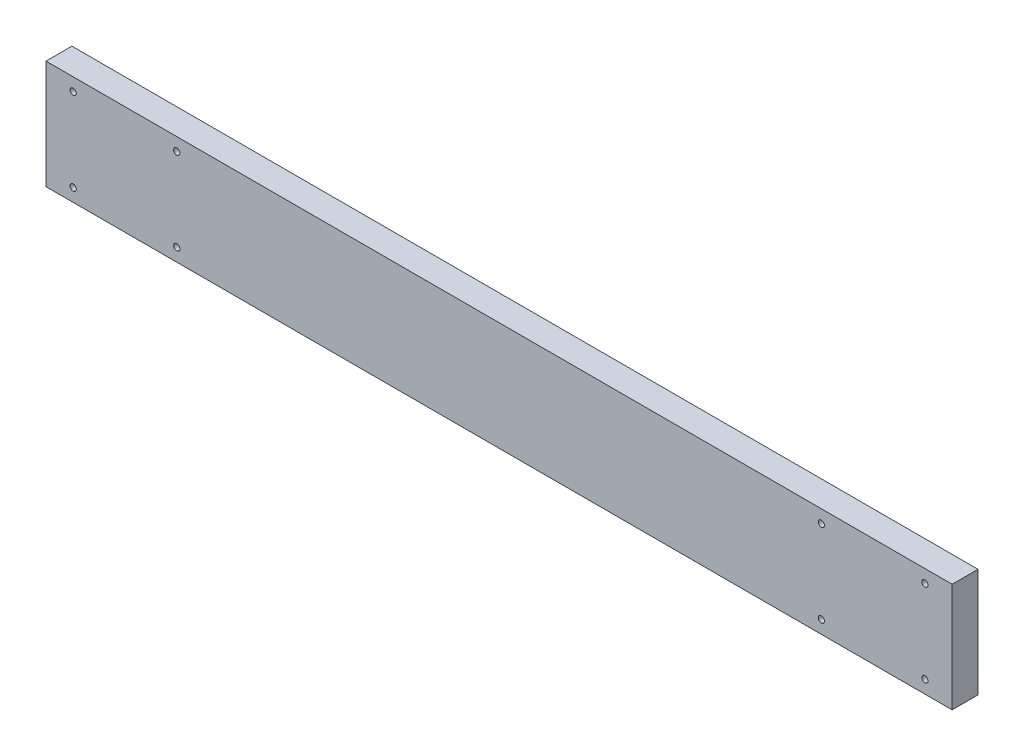
ISO-10303-21;
HEADER;
FILE_DESCRIPTION(('STEP AP214'),'2;1');
FILE_NAME('part.step','',(''),(''),'','','');
FILE_SCHEMA(('AUTOMOTIVE_DESIGN { 1 0 10303 214 1 1 1 1 }'));
ENDSEC;
DATA;
#1=APPLICATION_CONTEXT('core data for automotive mechanical design processes');
#2=APPLICATION_PROTOCOL_DEFINITION('international standard','automotive_design',2000,#1);
#3=PRODUCT_CONTEXT('',#1,'mechanical');
#4=PRODUCT('Part','Part','',(#3));
#5=PRODUCT_RELATED_PRODUCT_CATEGORY('part','',(#4));
#6=PRODUCT_DEFINITION_FORMATION('','',#4);
#7=PRODUCT_DEFINITION_CONTEXT('part definition',#1,'design');
#8=PRODUCT_DEFINITION('design','',#6,#7);
#9=PRODUCT_DEFINITION_SHAPE('','',#8);
#10=(LENGTH_UNIT() NAMED_UNIT(*) SI_UNIT(.MILLI.,.METRE.));
#11=(NAMED_UNIT(*) PLANE_ANGLE_UNIT() SI_UNIT($,.RADIAN.));
#12=(NAMED_UNIT(*) SI_UNIT($,.STERADIAN.) SOLID_ANGLE_UNIT());
#13=UNCERTAINTY_MEASURE_WITH_UNIT(LENGTH_MEASURE(1.E-05),#10,'distance_accuracy_value','');
#14=(GEOMETRIC_REPRESENTATION_CONTEXT(3) GLOBAL_UNCERTAINTY_ASSIGNED_CONTEXT((#13)) GLOBAL_UNIT_ASSIGNED_CONTEXT((#10,
#11,#12)) REPRESENTATION_CONTEXT('',''));
#15=CARTESIAN_POINT('',(0.,0.,0.));
#16=DIRECTION('',(0.,0.,1.));
#17=DIRECTION('',(1.,0.,0.));
#18=AXIS2_PLACEMENT_3D('',#15,#16,#17);
#19=CARTESIAN_POINT('',(0.,0.,10.));
#20=DIRECTION('',(0.,0.,-1.));
#21=DIRECTION('',(-1.,0.,0.));
#22=AXIS2_PLACEMENT_3D('',#19,#20,#21);
#23=PLANE('',#22);
#24=CARTESIAN_POINT('',(-164.5,16.01,10.));
#25=DIRECTION('',(0.,0.,1.));
#26=DIRECTION('',(1.,0.,0.));
#27=AXIS2_PLACEMENT_3D('',#24,#25,#26);
#28=CIRCLE('',#27,1.20000000000001);
#29=CARTESIAN_POINT('',(-163.3,16.01,10.));
#30=VERTEX_POINT('',#29);
#31=EDGE_CURVE('E195',#30,#30,#28,.T.);
#32=ORIENTED_EDGE('',*,*,#31,.F.);
#33=EDGE_LOOP('',(#32));
#34=FACE_BOUND('',#33,.T.);
#35=CARTESIAN_POINT('',(-124.5,16.01,10.));
#36=DIRECTION('',(0.,0.,1.));
#37=DIRECTION('',(1.,0.,0.));
#38=AXIS2_PLACEMENT_3D('',#35,#36,#37);
#39=CIRCLE('',#38,1.19999999999999);
#40=CARTESIAN_POINT('',(-123.3,16.01,10.));
#41=VERTEX_POINT('',#40);
#42=EDGE_CURVE('E187',#41,#41,#39,.T.);
#43=ORIENTED_EDGE('',*,*,#42,.F.);
#44=EDGE_LOOP('',(#43));
#45=FACE_BOUND('',#44,.T.);
#46=CARTESIAN_POINT('',(-164.5,-16.01,10.));
#47=DIRECTION('',(0.,0.,1.));
#48=DIRECTION('',(1.,0.,0.));
#49=AXIS2_PLACEMENT_3D('',#46,#47,#48);
#50=CIRCLE('',#49,1.20000000000001);
#51=CARTESIAN_POINT('',(-163.3,-16.01,10.));
#52=VERTEX_POINT('',#51);
#53=EDGE_CURVE('E171',#52,#52,#50,.T.);
#54=ORIENTED_EDGE('',*,*,#53,.F.);
#55=EDGE_LOOP('',(#54));
#56=FACE_BOUND('',#55,.T.);
#57=CARTESIAN_POINT('',(164.5,-16.01,10.));
#58=DIRECTION('',(0.,0.,1.));
#59=DIRECTION('',(1.,0.,0.));
#60=AXIS2_PLACEMENT_3D('',#57,#58,#59);
#61=CIRCLE('',#60,1.20000000000001);
#62=CARTESIAN_POINT('',(165.7,-16.01,10.));
#63=VERTEX_POINT('',#62);
#64=EDGE_CURVE('E163',#63,#63,#61,.T.);
#65=ORIENTED_EDGE('',*,*,#64,.F.);
#66=EDGE_LOOP('',(#65));
#67=FACE_BOUND('',#66,.T.);
#68=CARTESIAN_POINT('',(124.5,-16.01,10.));
#69=DIRECTION('',(0.,0.,1.));
#70=DIRECTION('',(1.,0.,0.));
#71=AXIS2_PLACEMENT_3D('',#68,#69,#70);
#72=CIRCLE('',#71,1.19999999999999);
#73=CARTESIAN_POINT('',(125.7,-16.01,10.));
#74=VERTEX_POINT('',#73);
#75=EDGE_CURVE('E155',#74,#74,#72,.T.);
#76=ORIENTED_EDGE('',*,*,#75,.F.);
#77=EDGE_LOOP('',(#76));
#78=FACE_BOUND('',#77,.T.);
#79=CARTESIAN_POINT('',(124.5,16.01,10.));
#80=DIRECTION('',(0.,0.,1.));
#81=DIRECTION('',(1.,0.,0.));
#82=AXIS2_PLACEMENT_3D('',#79,#80,#81);
#83=CIRCLE('',#82,1.19999999999999);
#84=CARTESIAN_POINT('',(125.7,16.01,10.));
#85=VERTEX_POINT('',#84);
#86=EDGE_CURVE('E147',#85,#85,#83,.T.);
#87=ORIENTED_EDGE('',*,*,#86,.F.);
#88=EDGE_LOOP('',(#87));
#89=FACE_BOUND('',#88,.T.);
#90=CARTESIAN_POINT('',(164.5,16.01,10.));
#91=DIRECTION('',(0.,0.,1.));
#92=DIRECTION('',(1.,0.,0.));
#93=AXIS2_PLACEMENT_3D('',#90,#91,#92);
#94=CIRCLE('',#93,1.20000000000001);
#95=CARTESIAN_POINT('',(165.7,16.01,10.));
#96=VERTEX_POINT('',#95);
#97=EDGE_CURVE('E139',#96,#96,#94,.T.);
#98=ORIENTED_EDGE('',*,*,#97,.F.);
#99=EDGE_LOOP('',(#98));
#100=FACE_BOUND('',#99,.T.);
#101=DIRECTION('',(0.,1.,0.));
#102=VECTOR('',#101,1.);
#103=CARTESIAN_POINT('',(175.,-21.01,10.));
#104=LINE('',#103,#102);
#105=CARTESIAN_POINT('',(175.,-21.01,10.));
#106=VERTEX_POINT('',#105);
#107=CARTESIAN_POINT('',(175.,21.01,10.));
#108=VERTEX_POINT('',#107);
#109=EDGE_CURVE('E98',#106,#108,#104,.T.);
#110=ORIENTED_EDGE('',*,*,#109,.T.);
#111=DIRECTION('',(-1.,0.,0.));
#112=VECTOR('',#111,1.);
#113=CARTESIAN_POINT('',(-175.,21.01,10.));
#114=LINE('',#113,#112);
#115=CARTESIAN_POINT('',(-175.,21.01,10.));
#116=VERTEX_POINT('',#115);
#117=EDGE_CURVE('E93',#108,#116,#114,.T.);
#118=ORIENTED_EDGE('',*,*,#117,.T.);
#119=DIRECTION('',(0.,-1.,0.));
#120=VECTOR('',#119,1.);
#121=CARTESIAN_POINT('',(-175.,-21.01,10.));
#122=LINE('',#121,#120);
#123=CARTESIAN_POINT('',(-175.,-21.01,10.));
#124=VERTEX_POINT('',#123);
#125=EDGE_CURVE('E96',#116,#124,#122,.T.);
#126=ORIENTED_EDGE('',*,*,#125,.T.);
#127=DIRECTION('',(1.,0.,0.));
#128=VECTOR('',#127,1.);
#129=CARTESIAN_POINT('',(-175.,-21.01,10.));
#130=LINE('',#129,#128);
#131=EDGE_CURVE('E63',#124,#106,#130,.T.);
#132=ORIENTED_EDGE('',*,*,#131,.T.);
#133=EDGE_LOOP('',(#110,#118,#126,#132));
#134=FACE_BOUND('',#133,.T.);
#135=CARTESIAN_POINT('',(-124.5,-16.01,10.));
#136=DIRECTION('',(0.,0.,1.));
#137=DIRECTION('',(1.,0.,0.));
#138=AXIS2_PLACEMENT_3D('',#135,#136,#137);
#139=CIRCLE('',#138,1.19999999999999);
#140=CARTESIAN_POINT('',(-123.3,-16.01,10.));
#141=VERTEX_POINT('',#140);
#142=EDGE_CURVE('E179',#141,#141,#139,.T.);
#143=ORIENTED_EDGE('',*,*,#142,.F.);
#144=EDGE_LOOP('',(#143));
#145=FACE_BOUND('',#144,.T.);
#146=ADVANCED_FACE('F45',(#34,#45,#56,#67,#78,#89,#100,#134,#145),#23,.F.);
#147=CARTESIAN_POINT('',(0.,0.,0.));
#148=DIRECTION('',(0.,0.,-1.));
#149=DIRECTION('',(-1.,0.,0.));
#150=AXIS2_PLACEMENT_3D('',#147,#148,#149);
#151=PLANE('',#150);
#152=CARTESIAN_POINT('',(-164.5,16.01,0.));
#153=DIRECTION('',(0.,0.,1.));
#154=DIRECTION('',(1.,0.,0.));
#155=AXIS2_PLACEMENT_3D('',#152,#153,#154);
#156=CIRCLE('',#155,1.20000000000001);
#157=CARTESIAN_POINT('',(-163.3,16.01,0.));
#158=VERTEX_POINT('',#157);
#159=EDGE_CURVE('E191',#158,#158,#156,.T.);
#160=ORIENTED_EDGE('',*,*,#159,.T.);
#161=EDGE_LOOP('',(#160));
#162=FACE_BOUND('',#161,.T.);
#163=CARTESIAN_POINT('',(-124.5,16.01,0.));
#164=DIRECTION('',(0.,0.,1.));
#165=DIRECTION('',(1.,0.,0.));
#166=AXIS2_PLACEMENT_3D('',#163,#164,#165);
#167=CIRCLE('',#166,1.19999999999999);
#168=CARTESIAN_POINT('',(-123.3,16.01,0.));
#169=VERTEX_POINT('',#168);
#170=EDGE_CURVE('E183',#169,#169,#167,.T.);
#171=ORIENTED_EDGE('',*,*,#170,.T.);
#172=EDGE_LOOP('',(#171));
#173=FACE_BOUND('',#172,.T.);
#174=CARTESIAN_POINT('',(-124.5,-16.01,0.));
#175=DIRECTION('',(0.,0.,1.));
#176=DIRECTION('',(1.,0.,0.));
#177=AXIS2_PLACEMENT_3D('',#174,#175,#176);
#178=CIRCLE('',#177,1.19999999999999);
#179=CARTESIAN_POINT('',(-123.3,-16.01,0.));
#180=VERTEX_POINT('',#179);
#181=EDGE_CURVE('E175',#180,#180,#178,.T.);
#182=ORIENTED_EDGE('',*,*,#181,.T.);
#183=EDGE_LOOP('',(#182));
#184=FACE_BOUND('',#183,.T.);
#185=CARTESIAN_POINT('',(-164.5,-16.01,0.));
#186=DIRECTION('',(0.,0.,1.));
#187=DIRECTION('',(1.,0.,0.));
#188=AXIS2_PLACEMENT_3D('',#185,#186,#187);
#189=CIRCLE('',#188,1.20000000000001);
#190=CARTESIAN_POINT('',(-163.3,-16.01,0.));
#191=VERTEX_POINT('',#190);
#192=EDGE_CURVE('E167',#191,#191,#189,.T.);
#193=ORIENTED_EDGE('',*,*,#192,.T.);
#194=EDGE_LOOP('',(#193));
#195=FACE_BOUND('',#194,.T.);
#196=DIRECTION('',(0.,1.,0.));
#197=VECTOR('',#196,1.);
#198=CARTESIAN_POINT('',(175.,-21.01,0.));
#199=LINE('',#198,#197);
#200=CARTESIAN_POINT('',(175.,-21.01,0.));
#201=VERTEX_POINT('',#200);
#202=CARTESIAN_POINT('',(175.,21.01,0.));
#203=VERTEX_POINT('',#202);
#204=EDGE_CURVE('E114',#201,#203,#199,.T.);
#205=ORIENTED_EDGE('',*,*,#204,.F.);
#206=DIRECTION('',(1.,0.,0.));
#207=VECTOR('',#206,1.);
#208=CARTESIAN_POINT('',(-175.,-21.01,0.));
#209=LINE('',#208,#207);
#210=CARTESIAN_POINT('',(-175.,-21.01,0.));
#211=VERTEX_POINT('',#210);
#212=EDGE_CURVE('E86',#211,#201,#209,.T.);
#213=ORIENTED_EDGE('',*,*,#212,.F.);
#214=DIRECTION('',(0.,-1.,0.));
#215=VECTOR('',#214,1.);
#216=CARTESIAN_POINT('',(-175.,-21.01,0.));
#217=LINE('',#216,#215);
#218=CARTESIAN_POINT('',(-175.,21.01,0.));
#219=VERTEX_POINT('',#218);
#220=EDGE_CURVE('E80',#219,#211,#217,.T.);
#221=ORIENTED_EDGE('',*,*,#220,.F.);
#222=DIRECTION('',(-1.,0.,0.));
#223=VECTOR('',#222,1.);
#224=CARTESIAN_POINT('',(-175.,21.01,0.));
#225=LINE('',#224,#223);
#226=EDGE_CURVE('E103',#203,#219,#225,.T.);
#227=ORIENTED_EDGE('',*,*,#226,.F.);
#228=EDGE_LOOP('',(#205,#213,#221,#227));
#229=FACE_BOUND('',#228,.T.);
#230=CARTESIAN_POINT('',(164.5,16.01,0.));
#231=DIRECTION('',(0.,0.,1.));
#232=DIRECTION('',(1.,0.,0.));
#233=AXIS2_PLACEMENT_3D('',#230,#231,#232);
#234=CIRCLE('',#233,1.20000000000001);
#235=CARTESIAN_POINT('',(165.7,16.01,0.));
#236=VERTEX_POINT('',#235);
#237=EDGE_CURVE('E118',#236,#236,#234,.T.);
#238=ORIENTED_EDGE('',*,*,#237,.T.);
#239=EDGE_LOOP('',(#238));
#240=FACE_BOUND('',#239,.T.);
#241=CARTESIAN_POINT('',(124.5,16.01,0.));
#242=DIRECTION('',(0.,0.,1.));
#243=DIRECTION('',(1.,0.,0.));
#244=AXIS2_PLACEMENT_3D('',#241,#242,#243);
#245=CIRCLE('',#244,1.19999999999999);
#246=CARTESIAN_POINT('',(125.7,16.01,0.));
#247=VERTEX_POINT('',#246);
#248=EDGE_CURVE('E143',#247,#247,#245,.T.);
#249=ORIENTED_EDGE('',*,*,#248,.T.);
#250=EDGE_LOOP('',(#249));
#251=FACE_BOUND('',#250,.T.);
#252=CARTESIAN_POINT('',(124.5,-16.01,0.));
#253=DIRECTION('',(0.,0.,1.));
#254=DIRECTION('',(1.,0.,0.));
#255=AXIS2_PLACEMENT_3D('',#252,#253,#254);
#256=CIRCLE('',#255,1.19999999999999);
#257=CARTESIAN_POINT('',(125.7,-16.01,0.));
#258=VERTEX_POINT('',#257);
#259=EDGE_CURVE('E151',#258,#258,#256,.T.);
#260=ORIENTED_EDGE('',*,*,#259,.T.);
#261=EDGE_LOOP('',(#260));
#262=FACE_BOUND('',#261,.T.);
#263=CARTESIAN_POINT('',(164.5,-16.01,0.));
#264=DIRECTION('',(0.,0.,1.));
#265=DIRECTION('',(1.,0.,0.));
#266=AXIS2_PLACEMENT_3D('',#263,#264,#265);
#267=CIRCLE('',#266,1.20000000000001);
#268=CARTESIAN_POINT('',(165.7,-16.01,0.));
#269=VERTEX_POINT('',#268);
#270=EDGE_CURVE('E159',#269,#269,#267,.T.);
#271=ORIENTED_EDGE('',*,*,#270,.T.);
#272=EDGE_LOOP('',(#271));
#273=FACE_BOUND('',#272,.T.);
#274=ADVANCED_FACE('F131',(#162,#173,#184,#195,#229,#240,#251,#262,#273),#151,.T.);
#275=CARTESIAN_POINT('',(175.,-21.01,10.));
#276=DIRECTION('',(-1.,0.,0.));
#277=DIRECTION('',(0.,0.,1.));
#278=AXIS2_PLACEMENT_3D('',#275,#276,#277);
#279=PLANE('',#278);
#280=ORIENTED_EDGE('',*,*,#204,.T.);
#281=DIRECTION('',(0.,0.,-1.));
#282=VECTOR('',#281,1.);
#283=CARTESIAN_POINT('',(175.,21.01,10.));
#284=LINE('',#283,#282);
#285=EDGE_CURVE('E11',#108,#203,#284,.T.);
#286=ORIENTED_EDGE('',*,*,#285,.F.);
#287=ORIENTED_EDGE('',*,*,#109,.F.);
#288=DIRECTION('',(0.,0.,-1.));
#289=VECTOR('',#288,1.);
#290=CARTESIAN_POINT('',(175.,-21.01,10.));
#291=LINE('',#290,#289);
#292=EDGE_CURVE('E110',#106,#201,#291,.T.);
#293=ORIENTED_EDGE('',*,*,#292,.T.);
#294=EDGE_LOOP('',(#280,#286,#287,#293));
#295=FACE_BOUND('',#294,.T.);
#296=ADVANCED_FACE('F47',(#295),#279,.F.);
#297=CARTESIAN_POINT('',(-175.,21.01,10.));
#298=DIRECTION('',(0.,-1.,0.));
#299=DIRECTION('',(0.,0.,-1.));
#300=AXIS2_PLACEMENT_3D('',#297,#298,#299);
#301=PLANE('',#300);
#302=ORIENTED_EDGE('',*,*,#226,.T.);
#303=DIRECTION('',(0.,0.,-1.));
#304=VECTOR('',#303,1.);
#305=CARTESIAN_POINT('',(-175.,21.01,10.));
#306=LINE('',#305,#304);
#307=EDGE_CURVE('E55',#116,#219,#306,.T.);
#308=ORIENTED_EDGE('',*,*,#307,.F.);
#309=ORIENTED_EDGE('',*,*,#117,.F.);
#310=ORIENTED_EDGE('',*,*,#285,.T.);
#311=EDGE_LOOP('',(#302,#308,#309,#310));
#312=FACE_BOUND('',#311,.T.);
#313=ADVANCED_FACE('F102',(#312),#301,.F.);
#314=CARTESIAN_POINT('',(-175.,-21.01,10.));
#315=DIRECTION('',(1.,0.,0.));
#316=DIRECTION('',(0.,0.,-1.));
#317=AXIS2_PLACEMENT_3D('',#314,#315,#316);
#318=PLANE('',#317);
#319=ORIENTED_EDGE('',*,*,#220,.T.);
#320=DIRECTION('',(0.,0.,-1.));
#321=VECTOR('',#320,1.);
#322=CARTESIAN_POINT('',(-175.,-21.01,10.));
#323=LINE('',#322,#321);
#324=EDGE_CURVE('E105',#124,#211,#323,.T.);
#325=ORIENTED_EDGE('',*,*,#324,.F.);
#326=ORIENTED_EDGE('',*,*,#125,.F.);
#327=ORIENTED_EDGE('',*,*,#307,.T.);
#328=EDGE_LOOP('',(#319,#325,#326,#327));
#329=FACE_BOUND('',#328,.T.);
#330=ADVANCED_FACE('F106',(#329),#318,.F.);
#331=CARTESIAN_POINT('',(-175.,-21.01,10.));
#332=DIRECTION('',(0.,1.,0.));
#333=DIRECTION('',(0.,0.,1.));
#334=AXIS2_PLACEMENT_3D('',#331,#332,#333);
#335=PLANE('',#334);
#336=ORIENTED_EDGE('',*,*,#212,.T.);
#337=ORIENTED_EDGE('',*,*,#292,.F.);
#338=ORIENTED_EDGE('',*,*,#131,.F.);
#339=ORIENTED_EDGE('',*,*,#324,.T.);
#340=EDGE_LOOP('',(#336,#337,#338,#339));
#341=FACE_BOUND('',#340,.T.);
#342=ADVANCED_FACE('F128',(#341),#335,.F.);
#343=CARTESIAN_POINT('',(164.5,16.01,10.));
#344=DIRECTION('',(0.,0.,1.));
#345=DIRECTION('',(1.,0.,0.));
#346=AXIS2_PLACEMENT_3D('',#343,#344,#345);
#347=CYLINDRICAL_SURFACE('',#346,1.20000000000001);
#348=ORIENTED_EDGE('',*,*,#237,.F.);
#349=EDGE_LOOP('',(#348));
#350=FACE_BOUND('',#349,.T.);
#351=ORIENTED_EDGE('',*,*,#97,.T.);
#352=EDGE_LOOP('',(#351));
#353=FACE_BOUND('',#352,.T.);
#354=ADVANCED_FACE('F217',(#350,#353),#347,.F.);
#355=CARTESIAN_POINT('',(124.5,16.01,10.));
#356=DIRECTION('',(0.,0.,1.));
#357=DIRECTION('',(1.,0.,0.));
#358=AXIS2_PLACEMENT_3D('',#355,#356,#357);
#359=CYLINDRICAL_SURFACE('',#358,1.19999999999999);
#360=ORIENTED_EDGE('',*,*,#248,.F.);
#361=EDGE_LOOP('',(#360));
#362=FACE_BOUND('',#361,.T.);
#363=ORIENTED_EDGE('',*,*,#86,.T.);
#364=EDGE_LOOP('',(#363));
#365=FACE_BOUND('',#364,.T.);
#366=ADVANCED_FACE('F219',(#362,#365),#359,.F.);
#367=CARTESIAN_POINT('',(124.5,-16.01,10.));
#368=DIRECTION('',(0.,0.,1.));
#369=DIRECTION('',(1.,0.,0.));
#370=AXIS2_PLACEMENT_3D('',#367,#368,#369);
#371=CYLINDRICAL_SURFACE('',#370,1.19999999999999);
#372=ORIENTED_EDGE('',*,*,#259,.F.);
#373=EDGE_LOOP('',(#372));
#374=FACE_BOUND('',#373,.T.);
#375=ORIENTED_EDGE('',*,*,#75,.T.);
#376=EDGE_LOOP('',(#375));
#377=FACE_BOUND('',#376,.T.);
#378=ADVANCED_FACE('F226',(#374,#377),#371,.F.);
#379=CARTESIAN_POINT('',(164.5,-16.01,10.));
#380=DIRECTION('',(0.,0.,1.));
#381=DIRECTION('',(1.,0.,0.));
#382=AXIS2_PLACEMENT_3D('',#379,#380,#381);
#383=CYLINDRICAL_SURFACE('',#382,1.20000000000001);
#384=ORIENTED_EDGE('',*,*,#270,.F.);
#385=EDGE_LOOP('',(#384));
#386=FACE_BOUND('',#385,.T.);
#387=ORIENTED_EDGE('',*,*,#64,.T.);
#388=EDGE_LOOP('',(#387));
#389=FACE_BOUND('',#388,.T.);
#390=ADVANCED_FACE('F289',(#386,#389),#383,.F.);
#391=CARTESIAN_POINT('',(-164.5,-16.01,10.));
#392=DIRECTION('',(0.,0.,1.));
#393=DIRECTION('',(1.,0.,0.));
#394=AXIS2_PLACEMENT_3D('',#391,#392,#393);
#395=CYLINDRICAL_SURFACE('',#394,1.20000000000001);
#396=ORIENTED_EDGE('',*,*,#192,.F.);
#397=EDGE_LOOP('',(#396));
#398=FACE_BOUND('',#397,.T.);
#399=ORIENTED_EDGE('',*,*,#53,.T.);
#400=EDGE_LOOP('',(#399));
#401=FACE_BOUND('',#400,.T.);
#402=ADVANCED_FACE('F298',(#398,#401),#395,.F.);
#403=CARTESIAN_POINT('',(-124.5,-16.01,10.));
#404=DIRECTION('',(0.,0.,1.));
#405=DIRECTION('',(1.,0.,0.));
#406=AXIS2_PLACEMENT_3D('',#403,#404,#405);
#407=CYLINDRICAL_SURFACE('',#406,1.19999999999999);
#408=ORIENTED_EDGE('',*,*,#181,.F.);
#409=EDGE_LOOP('',(#408));
#410=FACE_BOUND('',#409,.T.);
#411=ORIENTED_EDGE('',*,*,#142,.T.);
#412=EDGE_LOOP('',(#411));
#413=FACE_BOUND('',#412,.T.);
#414=ADVANCED_FACE('F308',(#410,#413),#407,.F.);
#415=CARTESIAN_POINT('',(-124.5,16.01,10.));
#416=DIRECTION('',(0.,0.,1.));
#417=DIRECTION('',(1.,0.,0.));
#418=AXIS2_PLACEMENT_3D('',#415,#416,#417);
#419=CYLINDRICAL_SURFACE('',#418,1.19999999999999);
#420=ORIENTED_EDGE('',*,*,#170,.F.);
#421=EDGE_LOOP('',(#420));
#422=FACE_BOUND('',#421,.T.);
#423=ORIENTED_EDGE('',*,*,#42,.T.);
#424=EDGE_LOOP('',(#423));
#425=FACE_BOUND('',#424,.T.);
#426=ADVANCED_FACE('F318',(#422,#425),#419,.F.);
#427=CARTESIAN_POINT('',(-164.5,16.01,10.));
#428=DIRECTION('',(0.,0.,1.));
#429=DIRECTION('',(1.,0.,0.));
#430=AXIS2_PLACEMENT_3D('',#427,#428,#429);
#431=CYLINDRICAL_SURFACE('',#430,1.20000000000001);
#432=ORIENTED_EDGE('',*,*,#159,.F.);
#433=EDGE_LOOP('',(#432));
#434=FACE_BOUND('',#433,.T.);
#435=ORIENTED_EDGE('',*,*,#31,.T.);
#436=EDGE_LOOP('',(#435));
#437=FACE_BOUND('',#436,.T.);
#438=ADVANCED_FACE('F200',(#434,#437),#431,.F.);
#439=CLOSED_SHELL('',(#146,#274,#296,#313,#330,#342,#354,#366,#378,#390,#402,#414,#426,#438));
#440=MANIFOLD_SOLID_BREP('B2',#439);
#441=ADVANCED_BREP_SHAPE_REPRESENTATION('',(#18,#440),#14);
#442=SHAPE_DEFINITION_REPRESENTATION(#9,#441);
ENDSEC;
END-ISO-10303-21;
